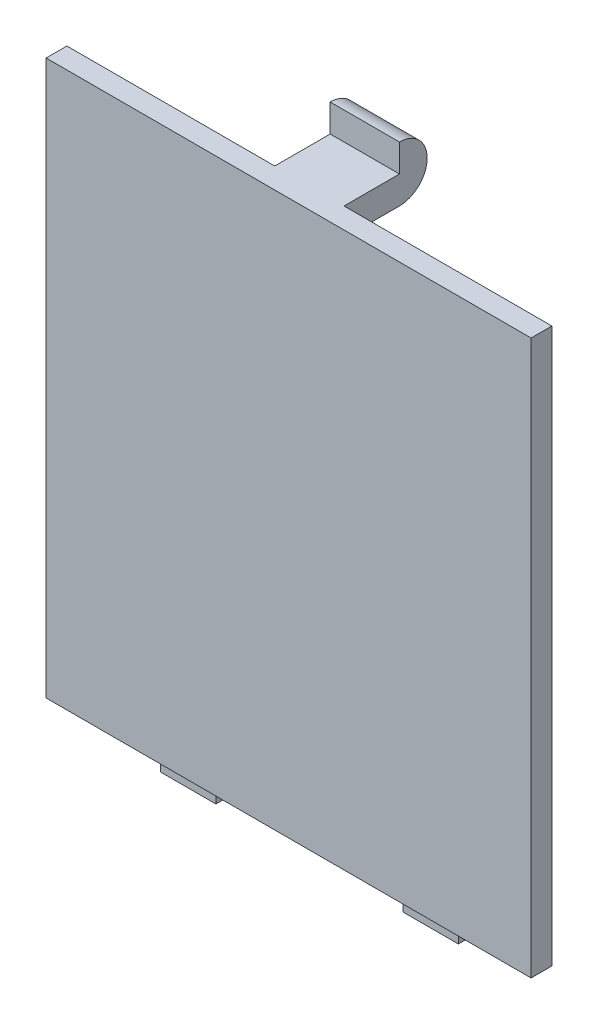
ISO-10303-21;
HEADER;
FILE_DESCRIPTION(('STEP AP214'),'2;1');
FILE_NAME('part.step','',(''),(''),'','','');
FILE_SCHEMA(('AUTOMOTIVE_DESIGN { 1 0 10303 214 1 1 1 1 }'));
ENDSEC;
DATA;
#1=APPLICATION_CONTEXT('core data for automotive mechanical design processes');
#2=APPLICATION_PROTOCOL_DEFINITION('international standard','automotive_design',2000,#1);
#3=PRODUCT_CONTEXT('',#1,'mechanical');
#4=PRODUCT('Part','Part','',(#3));
#5=PRODUCT_RELATED_PRODUCT_CATEGORY('part','',(#4));
#6=PRODUCT_DEFINITION_FORMATION('','',#4);
#7=PRODUCT_DEFINITION_CONTEXT('part definition',#1,'design');
#8=PRODUCT_DEFINITION('design','',#6,#7);
#9=PRODUCT_DEFINITION_SHAPE('','',#8);
#10=(LENGTH_UNIT() NAMED_UNIT(*) SI_UNIT(.MILLI.,.METRE.));
#11=(NAMED_UNIT(*) PLANE_ANGLE_UNIT() SI_UNIT($,.RADIAN.));
#12=(NAMED_UNIT(*) SI_UNIT($,.STERADIAN.) SOLID_ANGLE_UNIT());
#13=UNCERTAINTY_MEASURE_WITH_UNIT(LENGTH_MEASURE(1.E-05),#10,'distance_accuracy_value','');
#14=(GEOMETRIC_REPRESENTATION_CONTEXT(3) GLOBAL_UNCERTAINTY_ASSIGNED_CONTEXT((#13)) GLOBAL_UNIT_ASSIGNED_CONTEXT((#10,
#11,#12)) REPRESENTATION_CONTEXT('',''));
#15=CARTESIAN_POINT('',(0.,0.,0.));
#16=DIRECTION('',(0.,0.,1.));
#17=DIRECTION('',(1.,0.,0.));
#18=AXIS2_PLACEMENT_3D('',#15,#16,#17);
#19=CARTESIAN_POINT('',(5.,45.,-8.));
#20=DIRECTION('',(1.,0.,0.));
#21=DIRECTION('',(0.,0.,-1.));
#22=AXIS2_PLACEMENT_3D('',#19,#20,#21);
#23=CYLINDRICAL_SURFACE('',#22,4.);
#24=DIRECTION('',(1.,0.,0.));
#25=VECTOR('',#24,1.);
#26=CARTESIAN_POINT('',(5.,41.,-8.));
#27=LINE('',#26,#25);
#28=CARTESIAN_POINT('',(-5.,41.,-8.));
#29=VERTEX_POINT('',#28);
#30=CARTESIAN_POINT('',(5.,41.,-8.));
#31=VERTEX_POINT('',#30);
#32=EDGE_CURVE('E316',#29,#31,#27,.T.);
#33=ORIENTED_EDGE('',*,*,#32,.F.);
#34=CARTESIAN_POINT('',(-5.,45.,-8.));
#35=DIRECTION('',(-1.,0.,0.));
#36=DIRECTION('',(0.,-1.,0.));
#37=AXIS2_PLACEMENT_3D('',#34,#35,#36);
#38=CIRCLE('',#37,4.);
#39=CARTESIAN_POINT('',(-5.,45.,-12.));
#40=VERTEX_POINT('',#39);
#41=EDGE_CURVE('E29',#40,#29,#38,.T.);
#42=ORIENTED_EDGE('',*,*,#41,.F.);
#43=DIRECTION('',(-1.,0.,0.));
#44=VECTOR('',#43,1.);
#45=CARTESIAN_POINT('',(5.,45.,-12.));
#46=LINE('',#45,#44);
#47=CARTESIAN_POINT('',(5.,45.,-12.));
#48=VERTEX_POINT('',#47);
#49=EDGE_CURVE('E326',#40,#48,#46,.F.);
#50=ORIENTED_EDGE('',*,*,#49,.T.);
#51=CARTESIAN_POINT('',(5.,45.,-8.));
#52=DIRECTION('',(1.,0.,0.));
#53=DIRECTION('',(0.,1.,0.));
#54=AXIS2_PLACEMENT_3D('',#51,#52,#53);
#55=CIRCLE('',#54,4.);
#56=EDGE_CURVE('E12',#31,#48,#55,.T.);
#57=ORIENTED_EDGE('',*,*,#56,.F.);
#58=EDGE_LOOP('',(#33,#42,#50,#57));
#59=FACE_BOUND('',#58,.T.);
#60=ADVANCED_FACE('F20',(#59),#23,.T.);
#61=CARTESIAN_POINT('',(5.,45.,-8.));
#62=DIRECTION('',(1.,0.,0.));
#63=DIRECTION('',(0.,0.,-1.));
#64=AXIS2_PLACEMENT_3D('',#61,#62,#63);
#65=CYLINDRICAL_SURFACE('',#64,4.);
#66=DIRECTION('',(-1.,0.,0.));
#67=VECTOR('',#66,1.);
#68=CARTESIAN_POINT('',(5.,49.,-8.));
#69=LINE('',#68,#67);
#70=CARTESIAN_POINT('',(5.,49.,-8.));
#71=VERTEX_POINT('',#70);
#72=CARTESIAN_POINT('',(-5.,49.,-8.));
#73=VERTEX_POINT('',#72);
#74=EDGE_CURVE('E168',#71,#73,#69,.T.);
#75=ORIENTED_EDGE('',*,*,#74,.F.);
#76=CARTESIAN_POINT('',(5.,45.,-8.));
#77=DIRECTION('',(1.,0.,0.));
#78=DIRECTION('',(0.,1.,0.));
#79=AXIS2_PLACEMENT_3D('',#76,#77,#78);
#80=CIRCLE('',#79,4.);
#81=EDGE_CURVE('E163',#48,#71,#80,.T.);
#82=ORIENTED_EDGE('',*,*,#81,.F.);
#83=ORIENTED_EDGE('',*,*,#49,.F.);
#84=CARTESIAN_POINT('',(-5.,45.,-8.));
#85=DIRECTION('',(-1.,0.,0.));
#86=DIRECTION('',(0.,-1.,0.));
#87=AXIS2_PLACEMENT_3D('',#84,#85,#86);
#88=CIRCLE('',#87,4.);
#89=EDGE_CURVE('E320',#73,#40,#88,.T.);
#90=ORIENTED_EDGE('',*,*,#89,.F.);
#91=EDGE_LOOP('',(#75,#82,#83,#90));
#92=FACE_BOUND('',#91,.T.);
#93=ADVANCED_FACE('F381',(#92),#65,.T.);
#94=CARTESIAN_POINT('',(-13.5,-34.,0.));
#95=DIRECTION('',(-1.,0.,0.));
#96=DIRECTION('',(0.,0.,1.));
#97=AXIS2_PLACEMENT_3D('',#94,#95,#96);
#98=CYLINDRICAL_SURFACE('',#97,3.);
#99=DIRECTION('',(-1.,0.,0.));
#100=VECTOR('',#99,1.);
#101=CARTESIAN_POINT('',(-13.5,-31.,0.));
#102=LINE('',#101,#100);
#103=CARTESIAN_POINT('',(-13.5,-31.,0.));
#104=VERTEX_POINT('',#103);
#105=CARTESIAN_POINT('',(-21.5,-31.,0.));
#106=VERTEX_POINT('',#105);
#107=EDGE_CURVE('E263',#104,#106,#102,.T.);
#108=ORIENTED_EDGE('',*,*,#107,.F.);
#109=CARTESIAN_POINT('',(-13.5,-34.,0.));
#110=DIRECTION('',(1.,0.,0.));
#111=DIRECTION('',(0.,1.,0.));
#112=AXIS2_PLACEMENT_3D('',#109,#110,#111);
#113=CIRCLE('',#112,3.);
#114=CARTESIAN_POINT('',(-13.5,-34.,-3.));
#115=VERTEX_POINT('',#114);
#116=EDGE_CURVE('E332',#115,#104,#113,.T.);
#117=ORIENTED_EDGE('',*,*,#116,.F.);
#118=DIRECTION('',(-1.,0.,0.));
#119=VECTOR('',#118,1.);
#120=CARTESIAN_POINT('',(0.,-34.,-3.));
#121=LINE('',#120,#119);
#122=CARTESIAN_POINT('',(-21.5,-34.,-3.));
#123=VERTEX_POINT('',#122);
#124=EDGE_CURVE('E335',#123,#115,#121,.F.);
#125=ORIENTED_EDGE('',*,*,#124,.F.);
#126=CARTESIAN_POINT('',(-21.5,-34.,0.));
#127=DIRECTION('',(-1.,0.,0.));
#128=DIRECTION('',(0.,0.,1.));
#129=AXIS2_PLACEMENT_3D('',#126,#127,#128);
#130=CIRCLE('',#129,3.);
#131=EDGE_CURVE('E329',#106,#123,#130,.T.);
#132=ORIENTED_EDGE('',*,*,#131,.F.);
#133=EDGE_LOOP('',(#108,#117,#125,#132));
#134=FACE_BOUND('',#133,.T.);
#135=ADVANCED_FACE('F389',(#134),#98,.T.);
#136=CARTESIAN_POINT('',(21.5,-34.,0.));
#137=DIRECTION('',(-1.,0.,0.));
#138=DIRECTION('',(0.,0.,1.));
#139=AXIS2_PLACEMENT_3D('',#136,#137,#138);
#140=CYLINDRICAL_SURFACE('',#139,3.);
#141=DIRECTION('',(-1.,0.,0.));
#142=VECTOR('',#141,1.);
#143=CARTESIAN_POINT('',(21.5,-31.,0.));
#144=LINE('',#143,#142);
#145=CARTESIAN_POINT('',(21.5,-31.,0.));
#146=VERTEX_POINT('',#145);
#147=CARTESIAN_POINT('',(13.5,-31.,0.));
#148=VERTEX_POINT('',#147);
#149=EDGE_CURVE('E693',#146,#148,#144,.T.);
#150=ORIENTED_EDGE('',*,*,#149,.F.);
#151=CARTESIAN_POINT('',(21.5,-34.,0.));
#152=DIRECTION('',(1.,0.,0.));
#153=DIRECTION('',(0.,0.,-1.));
#154=AXIS2_PLACEMENT_3D('',#151,#152,#153);
#155=CIRCLE('',#154,3.);
#156=CARTESIAN_POINT('',(21.5,-34.,-3.));
#157=VERTEX_POINT('',#156);
#158=EDGE_CURVE('E342',#157,#146,#155,.T.);
#159=ORIENTED_EDGE('',*,*,#158,.F.);
#160=DIRECTION('',(-1.,0.,0.));
#161=VECTOR('',#160,1.);
#162=CARTESIAN_POINT('',(0.,-34.,-3.));
#163=LINE('',#162,#161);
#164=CARTESIAN_POINT('',(13.5,-34.,-3.));
#165=VERTEX_POINT('',#164);
#166=EDGE_CURVE('E345',#165,#157,#163,.F.);
#167=ORIENTED_EDGE('',*,*,#166,.F.);
#168=CARTESIAN_POINT('',(13.5,-34.,0.));
#169=DIRECTION('',(-1.,0.,0.));
#170=DIRECTION('',(0.,-1.,0.));
#171=AXIS2_PLACEMENT_3D('',#168,#169,#170);
#172=CIRCLE('',#171,3.);
#173=EDGE_CURVE('E339',#148,#165,#172,.T.);
#174=ORIENTED_EDGE('',*,*,#173,.F.);
#175=EDGE_LOOP('',(#150,#159,#167,#174));
#176=FACE_BOUND('',#175,.T.);
#177=ADVANCED_FACE('F393',(#176),#140,.T.);
#178=CARTESIAN_POINT('',(-35.,45.,3.));
#179=DIRECTION('',(1.,0.,0.));
#180=DIRECTION('',(0.,1.,0.));
#181=AXIS2_PLACEMENT_3D('',#178,#179,#180);
#182=PLANE('',#181);
#183=DIRECTION('',(0.,-1.,0.));
#184=VECTOR('',#183,1.);
#185=CARTESIAN_POINT('',(-35.,45.,0.));
#186=LINE('',#185,#184);
#187=CARTESIAN_POINT('',(-35.,45.,0.));
#188=VERTEX_POINT('',#187);
#189=CARTESIAN_POINT('',(-35.,-35.,0.));
#190=VERTEX_POINT('',#189);
#191=EDGE_CURVE('E228',#188,#190,#186,.T.);
#192=ORIENTED_EDGE('',*,*,#191,.T.);
#193=DIRECTION('',(0.,0.,-1.));
#194=VECTOR('',#193,1.);
#195=CARTESIAN_POINT('',(-35.,-35.,3.));
#196=LINE('',#195,#194);
#197=CARTESIAN_POINT('',(-35.,-35.,3.));
#198=VERTEX_POINT('',#197);
#199=EDGE_CURVE('E354',#198,#190,#196,.T.);
#200=ORIENTED_EDGE('',*,*,#199,.F.);
#201=DIRECTION('',(0.,-1.,0.));
#202=VECTOR('',#201,1.);
#203=CARTESIAN_POINT('',(-35.,45.,3.));
#204=LINE('',#203,#202);
#205=CARTESIAN_POINT('',(-35.,45.,3.));
#206=VERTEX_POINT('',#205);
#207=EDGE_CURVE('E210',#206,#198,#204,.T.);
#208=ORIENTED_EDGE('',*,*,#207,.F.);
#209=DIRECTION('',(0.,0.,-1.));
#210=VECTOR('',#209,1.);
#211=CARTESIAN_POINT('',(-35.,45.,3.));
#212=LINE('',#211,#210);
#213=EDGE_CURVE('E227',#206,#188,#212,.T.);
#214=ORIENTED_EDGE('',*,*,#213,.T.);
#215=EDGE_LOOP('',(#192,#200,#208,#214));
#216=FACE_BOUND('',#215,.T.);
#217=ADVANCED_FACE('F399',(#216),#182,.F.);
#218=CARTESIAN_POINT('',(-35.,-35.,3.));
#219=DIRECTION('',(0.,1.,0.));
#220=DIRECTION('',(0.,0.,1.));
#221=AXIS2_PLACEMENT_3D('',#218,#219,#220);
#222=PLANE('',#221);
#223=DIRECTION('',(1.,0.,0.));
#224=VECTOR('',#223,1.);
#225=CARTESIAN_POINT('',(-35.,-35.,0.));
#226=LINE('',#225,#224);
#227=CARTESIAN_POINT('',(-21.5,-35.,0.));
#228=VERTEX_POINT('',#227);
#229=EDGE_CURVE('E235',#190,#228,#226,.T.);
#230=ORIENTED_EDGE('',*,*,#229,.T.);
#231=CARTESIAN_POINT('',(-13.5,-35.,0.));
#232=VERTEX_POINT('',#231);
#233=EDGE_CURVE('E241',#228,#232,#226,.T.);
#234=ORIENTED_EDGE('',*,*,#233,.T.);
#235=CARTESIAN_POINT('',(13.5,-35.,0.));
#236=VERTEX_POINT('',#235);
#237=EDGE_CURVE('E242',#232,#236,#226,.T.);
#238=ORIENTED_EDGE('',*,*,#237,.T.);
#239=CARTESIAN_POINT('',(21.5,-35.,0.));
#240=VERTEX_POINT('',#239);
#241=EDGE_CURVE('E243',#236,#240,#226,.T.);
#242=ORIENTED_EDGE('',*,*,#241,.T.);
#243=CARTESIAN_POINT('',(35.,-35.,0.));
#244=VERTEX_POINT('',#243);
#245=EDGE_CURVE('E233',#240,#244,#226,.T.);
#246=ORIENTED_EDGE('',*,*,#245,.T.);
#247=DIRECTION('',(0.,0.,-1.));
#248=VECTOR('',#247,1.);
#249=CARTESIAN_POINT('',(35.,-35.,3.));
#250=LINE('',#249,#248);
#251=CARTESIAN_POINT('',(35.,-35.,3.));
#252=VERTEX_POINT('',#251);
#253=EDGE_CURVE('E358',#252,#244,#250,.T.);
#254=ORIENTED_EDGE('',*,*,#253,.F.);
#255=DIRECTION('',(1.,0.,0.));
#256=VECTOR('',#255,1.);
#257=CARTESIAN_POINT('',(-35.,-35.,3.));
#258=LINE('',#257,#256);
#259=EDGE_CURVE('E216',#198,#252,#258,.T.);
#260=ORIENTED_EDGE('',*,*,#259,.F.);
#261=ORIENTED_EDGE('',*,*,#199,.T.);
#262=EDGE_LOOP('',(#230,#234,#238,#242,#246,#254,#260,#261));
#263=FACE_BOUND('',#262,.T.);
#264=ADVANCED_FACE('F403',(#263),#222,.F.);
#265=CARTESIAN_POINT('',(35.,45.,3.));
#266=DIRECTION('',(-1.,0.,0.));
#267=DIRECTION('',(0.,0.,1.));
#268=AXIS2_PLACEMENT_3D('',#265,#266,#267);
#269=PLANE('',#268);
#270=DIRECTION('',(0.,1.,0.));
#271=VECTOR('',#270,1.);
#272=CARTESIAN_POINT('',(35.,45.,0.));
#273=LINE('',#272,#271);
#274=CARTESIAN_POINT('',(35.,45.,0.));
#275=VERTEX_POINT('',#274);
#276=EDGE_CURVE('E240',#244,#275,#273,.T.);
#277=ORIENTED_EDGE('',*,*,#276,.T.);
#278=DIRECTION('',(0.,0.,-1.));
#279=VECTOR('',#278,1.);
#280=CARTESIAN_POINT('',(35.,45.,3.));
#281=LINE('',#280,#279);
#282=CARTESIAN_POINT('',(35.,45.,3.));
#283=VERTEX_POINT('',#282);
#284=EDGE_CURVE('E362',#283,#275,#281,.T.);
#285=ORIENTED_EDGE('',*,*,#284,.F.);
#286=DIRECTION('',(0.,1.,0.));
#287=VECTOR('',#286,1.);
#288=CARTESIAN_POINT('',(35.,45.,3.));
#289=LINE('',#288,#287);
#290=EDGE_CURVE('E221',#252,#283,#289,.T.);
#291=ORIENTED_EDGE('',*,*,#290,.F.);
#292=ORIENTED_EDGE('',*,*,#253,.T.);
#293=EDGE_LOOP('',(#277,#285,#291,#292));
#294=FACE_BOUND('',#293,.T.);
#295=ADVANCED_FACE('F374',(#294),#269,.F.);
#296=CARTESIAN_POINT('',(-35.,45.,3.));
#297=DIRECTION('',(0.,-1.,0.));
#298=DIRECTION('',(0.,0.,-1.));
#299=AXIS2_PLACEMENT_3D('',#296,#297,#298);
#300=PLANE('',#299);
#301=DIRECTION('',(0.,0.,1.));
#302=VECTOR('',#301,1.);
#303=CARTESIAN_POINT('',(5.,45.,-12.));
#304=LINE('',#303,#302);
#305=CARTESIAN_POINT('',(5.,45.,-8.));
#306=VERTEX_POINT('',#305);
#307=CARTESIAN_POINT('',(5.,45.,0.));
#308=VERTEX_POINT('',#307);
#309=EDGE_CURVE('E160',#306,#308,#304,.T.);
#310=ORIENTED_EDGE('',*,*,#309,.F.);
#311=DIRECTION('',(-1.,0.,0.));
#312=VECTOR('',#311,1.);
#313=CARTESIAN_POINT('',(5.,45.,-8.));
#314=LINE('',#313,#312);
#315=CARTESIAN_POINT('',(-5.,45.,-8.));
#316=VERTEX_POINT('',#315);
#317=EDGE_CURVE('E172',#306,#316,#314,.T.);
#318=ORIENTED_EDGE('',*,*,#317,.T.);
#319=DIRECTION('',(0.,0.,1.));
#320=VECTOR('',#319,1.);
#321=CARTESIAN_POINT('',(-5.,45.,-12.));
#322=LINE('',#321,#320);
#323=CARTESIAN_POINT('',(-5.,45.,0.));
#324=VERTEX_POINT('',#323);
#325=EDGE_CURVE('E186',#316,#324,#322,.T.);
#326=ORIENTED_EDGE('',*,*,#325,.T.);
#327=DIRECTION('',(-1.,0.,0.));
#328=VECTOR('',#327,1.);
#329=CARTESIAN_POINT('',(-35.,45.,0.));
#330=LINE('',#329,#328);
#331=EDGE_CURVE('E300',#324,#188,#330,.T.);
#332=ORIENTED_EDGE('',*,*,#331,.T.);
#333=ORIENTED_EDGE('',*,*,#213,.F.);
#334=DIRECTION('',(-1.,0.,0.));
#335=VECTOR('',#334,1.);
#336=CARTESIAN_POINT('',(-35.,45.,3.));
#337=LINE('',#336,#335);
#338=EDGE_CURVE('E224',#283,#206,#337,.T.);
#339=ORIENTED_EDGE('',*,*,#338,.F.);
#340=ORIENTED_EDGE('',*,*,#284,.T.);
#341=EDGE_CURVE('E184',#275,#308,#330,.T.);
#342=ORIENTED_EDGE('',*,*,#341,.T.);
#343=EDGE_LOOP('',(#310,#318,#326,#332,#333,#339,#340,#342));
#344=FACE_BOUND('',#343,.T.);
#345=ADVANCED_FACE('F181',(#344),#300,.F.);
#346=CARTESIAN_POINT('',(0.,0.,3.));
#347=DIRECTION('',(0.,0.,1.));
#348=DIRECTION('',(1.,0.,0.));
#349=AXIS2_PLACEMENT_3D('',#346,#347,#348);
#350=PLANE('',#349);
#351=ORIENTED_EDGE('',*,*,#207,.T.);
#352=ORIENTED_EDGE('',*,*,#259,.T.);
#353=ORIENTED_EDGE('',*,*,#290,.T.);
#354=ORIENTED_EDGE('',*,*,#338,.T.);
#355=EDGE_LOOP('',(#351,#352,#353,#354));
#356=FACE_BOUND('',#355,.T.);
#357=ADVANCED_FACE('F412',(#356),#350,.T.);
#358=CARTESIAN_POINT('',(0.,0.,0.));
#359=DIRECTION('',(0.,0.,1.));
#360=DIRECTION('',(1.,0.,0.));
#361=AXIS2_PLACEMENT_3D('',#358,#359,#360);
#362=PLANE('',#361);
#363=DIRECTION('',(1.,0.,0.));
#364=VECTOR('',#363,1.);
#365=CARTESIAN_POINT('',(5.,41.,0.));
#366=LINE('',#365,#364);
#367=CARTESIAN_POINT('',(-5.,41.,0.));
#368=VERTEX_POINT('',#367);
#369=CARTESIAN_POINT('',(5.,41.,0.));
#370=VERTEX_POINT('',#369);
#371=EDGE_CURVE('E187',#368,#370,#366,.T.);
#372=ORIENTED_EDGE('',*,*,#371,.T.);
#373=DIRECTION('',(0.,1.,0.));
#374=VECTOR('',#373,1.);
#375=CARTESIAN_POINT('',(5.,45.,0.));
#376=LINE('',#375,#374);
#377=EDGE_CURVE('E178',#370,#308,#376,.T.);
#378=ORIENTED_EDGE('',*,*,#377,.T.);
#379=ORIENTED_EDGE('',*,*,#341,.F.);
#380=ORIENTED_EDGE('',*,*,#276,.F.);
#381=ORIENTED_EDGE('',*,*,#245,.F.);
#382=DIRECTION('',(0.,1.,0.));
#383=VECTOR('',#382,1.);
#384=CARTESIAN_POINT('',(21.5,-31.,0.));
#385=LINE('',#384,#383);
#386=EDGE_CURVE('E353',#240,#146,#385,.T.);
#387=ORIENTED_EDGE('',*,*,#386,.T.);
#388=ORIENTED_EDGE('',*,*,#149,.T.);
#389=DIRECTION('',(0.,-1.,0.));
#390=VECTOR('',#389,1.);
#391=CARTESIAN_POINT('',(13.5,-31.,0.));
#392=LINE('',#391,#390);
#393=EDGE_CURVE('E690',#148,#236,#392,.T.);
#394=ORIENTED_EDGE('',*,*,#393,.T.);
#395=ORIENTED_EDGE('',*,*,#237,.F.);
#396=DIRECTION('',(0.,1.,0.));
#397=VECTOR('',#396,1.);
#398=CARTESIAN_POINT('',(-13.5,0.,0.));
#399=LINE('',#398,#397);
#400=EDGE_CURVE('E349',#232,#104,#399,.T.);
#401=ORIENTED_EDGE('',*,*,#400,.T.);
#402=ORIENTED_EDGE('',*,*,#107,.T.);
#403=DIRECTION('',(0.,-1.,0.));
#404=VECTOR('',#403,1.);
#405=CARTESIAN_POINT('',(-21.5,-31.,0.));
#406=LINE('',#405,#404);
#407=EDGE_CURVE('E660',#106,#228,#406,.T.);
#408=ORIENTED_EDGE('',*,*,#407,.T.);
#409=ORIENTED_EDGE('',*,*,#229,.F.);
#410=ORIENTED_EDGE('',*,*,#191,.F.);
#411=ORIENTED_EDGE('',*,*,#331,.F.);
#412=DIRECTION('',(0.,-1.,0.));
#413=VECTOR('',#412,1.);
#414=CARTESIAN_POINT('',(-5.,45.,0.));
#415=LINE('',#414,#413);
#416=EDGE_CURVE('E195',#324,#368,#415,.T.);
#417=ORIENTED_EDGE('',*,*,#416,.T.);
#418=EDGE_LOOP('',(#372,#378,#379,#380,#381,#387,#388,#394,#395,#401,#402,#408,#409,#410,#411,#417));
#419=FACE_BOUND('',#418,.T.);
#420=ADVANCED_FACE('F298',(#419),#362,.F.);
#421=CARTESIAN_POINT('',(21.5,-31.,-3.));
#422=DIRECTION('',(1.,0.,0.));
#423=DIRECTION('',(0.,0.,-1.));
#424=AXIS2_PLACEMENT_3D('',#421,#422,#423);
#425=PLANE('',#424);
#426=DIRECTION('',(0.,1.,0.));
#427=VECTOR('',#426,1.);
#428=CARTESIAN_POINT('',(21.5,-31.,-3.));
#429=LINE('',#428,#427);
#430=CARTESIAN_POINT('',(21.5,-39.,-3.));
#431=VERTEX_POINT('',#430);
#432=EDGE_CURVE('E699',#431,#157,#429,.T.);
#433=ORIENTED_EDGE('',*,*,#432,.T.);
#434=ORIENTED_EDGE('',*,*,#158,.T.);
#435=ORIENTED_EDGE('',*,*,#386,.F.);
#436=CARTESIAN_POINT('',(21.5,-39.,0.));
#437=VERTEX_POINT('',#436);
#438=EDGE_CURVE('E262',#437,#240,#385,.T.);
#439=ORIENTED_EDGE('',*,*,#438,.F.);
#440=DIRECTION('',(0.,0.,1.));
#441=VECTOR('',#440,1.);
#442=CARTESIAN_POINT('',(21.5,-39.,-3.));
#443=LINE('',#442,#441);
#444=EDGE_CURVE('E234',#431,#437,#443,.T.);
#445=ORIENTED_EDGE('',*,*,#444,.F.);
#446=EDGE_LOOP('',(#433,#434,#435,#439,#445));
#447=FACE_BOUND('',#446,.T.);
#448=ADVANCED_FACE('F415',(#447),#425,.T.);
#449=CARTESIAN_POINT('',(21.5,-39.,-3.));
#450=DIRECTION('',(0.,-1.,0.));
#451=DIRECTION('',(0.,0.,-1.));
#452=AXIS2_PLACEMENT_3D('',#449,#450,#451);
#453=PLANE('',#452);
#454=DIRECTION('',(1.,0.,0.));
#455=VECTOR('',#454,1.);
#456=CARTESIAN_POINT('',(21.5,-39.,0.));
#457=LINE('',#456,#455);
#458=CARTESIAN_POINT('',(13.5,-39.,0.));
#459=VERTEX_POINT('',#458);
#460=EDGE_CURVE('E695',#459,#437,#457,.T.);
#461=ORIENTED_EDGE('',*,*,#460,.F.);
#462=DIRECTION('',(0.,0.,1.));
#463=VECTOR('',#462,1.);
#464=CARTESIAN_POINT('',(13.5,-39.,-3.));
#465=LINE('',#464,#463);
#466=CARTESIAN_POINT('',(13.5,-39.,-3.));
#467=VERTEX_POINT('',#466);
#468=EDGE_CURVE('E217',#467,#459,#465,.T.);
#469=ORIENTED_EDGE('',*,*,#468,.F.);
#470=DIRECTION('',(1.,0.,0.));
#471=VECTOR('',#470,1.);
#472=CARTESIAN_POINT('',(21.5,-39.,-3.));
#473=LINE('',#472,#471);
#474=EDGE_CURVE('E713',#467,#431,#473,.T.);
#475=ORIENTED_EDGE('',*,*,#474,.T.);
#476=ORIENTED_EDGE('',*,*,#444,.T.);
#477=EDGE_LOOP('',(#461,#469,#475,#476));
#478=FACE_BOUND('',#477,.T.);
#479=ADVANCED_FACE('F421',(#478),#453,.T.);
#480=CARTESIAN_POINT('',(13.5,-31.,-3.));
#481=DIRECTION('',(-1.,0.,0.));
#482=DIRECTION('',(0.,-1.,0.));
#483=AXIS2_PLACEMENT_3D('',#480,#481,#482);
#484=PLANE('',#483);
#485=ORIENTED_EDGE('',*,*,#393,.F.);
#486=ORIENTED_EDGE('',*,*,#173,.T.);
#487=DIRECTION('',(0.,-1.,0.));
#488=VECTOR('',#487,1.);
#489=CARTESIAN_POINT('',(13.5,-31.,-3.));
#490=LINE('',#489,#488);
#491=EDGE_CURVE('E709',#165,#467,#490,.T.);
#492=ORIENTED_EDGE('',*,*,#491,.T.);
#493=ORIENTED_EDGE('',*,*,#468,.T.);
#494=EDGE_CURVE('E685',#236,#459,#392,.T.);
#495=ORIENTED_EDGE('',*,*,#494,.F.);
#496=EDGE_LOOP('',(#485,#486,#492,#493,#495));
#497=FACE_BOUND('',#496,.T.);
#498=ADVANCED_FACE('F423',(#497),#484,.T.);
#499=CARTESIAN_POINT('',(0.,0.,-3.));
#500=DIRECTION('',(0.,0.,-1.));
#501=DIRECTION('',(-1.,0.,0.));
#502=AXIS2_PLACEMENT_3D('',#499,#500,#501);
#503=PLANE('',#502);
#504=ORIENTED_EDGE('',*,*,#491,.F.);
#505=ORIENTED_EDGE('',*,*,#166,.T.);
#506=ORIENTED_EDGE('',*,*,#432,.F.);
#507=ORIENTED_EDGE('',*,*,#474,.F.);
#508=EDGE_LOOP('',(#504,#505,#506,#507));
#509=FACE_BOUND('',#508,.T.);
#510=ADVANCED_FACE('F426',(#509),#503,.T.);
#511=CARTESIAN_POINT('',(0.,0.,0.));
#512=DIRECTION('',(0.,0.,-1.));
#513=DIRECTION('',(-1.,0.,0.));
#514=AXIS2_PLACEMENT_3D('',#511,#512,#513);
#515=PLANE('',#514);
#516=ORIENTED_EDGE('',*,*,#241,.F.);
#517=ORIENTED_EDGE('',*,*,#494,.T.);
#518=ORIENTED_EDGE('',*,*,#460,.T.);
#519=ORIENTED_EDGE('',*,*,#438,.T.);
#520=EDGE_LOOP('',(#516,#517,#518,#519));
#521=FACE_BOUND('',#520,.T.);
#522=ADVANCED_FACE('F431',(#521),#515,.F.);
#523=CARTESIAN_POINT('',(0.,0.,0.));
#524=DIRECTION('',(0.,0.,-1.));
#525=DIRECTION('',(-1.,0.,0.));
#526=AXIS2_PLACEMENT_3D('',#523,#524,#525);
#527=PLANE('',#526);
#528=DIRECTION('',(0.,1.,0.));
#529=VECTOR('',#528,1.);
#530=CARTESIAN_POINT('',(-13.5,-31.,0.));
#531=LINE('',#530,#529);
#532=CARTESIAN_POINT('',(-13.5,-39.,0.));
#533=VERTEX_POINT('',#532);
#534=EDGE_CURVE('E256',#533,#232,#531,.T.);
#535=ORIENTED_EDGE('',*,*,#534,.T.);
#536=ORIENTED_EDGE('',*,*,#233,.F.);
#537=CARTESIAN_POINT('',(-21.5,-39.,0.));
#538=VERTEX_POINT('',#537);
#539=EDGE_CURVE('E656',#228,#538,#406,.T.);
#540=ORIENTED_EDGE('',*,*,#539,.T.);
#541=DIRECTION('',(1.,0.,0.));
#542=VECTOR('',#541,1.);
#543=CARTESIAN_POINT('',(-13.5,-39.,0.));
#544=LINE('',#543,#542);
#545=EDGE_CURVE('E653',#538,#533,#544,.T.);
#546=ORIENTED_EDGE('',*,*,#545,.T.);
#547=EDGE_LOOP('',(#535,#536,#540,#546));
#548=FACE_BOUND('',#547,.T.);
#549=ADVANCED_FACE('F434',(#548),#527,.F.);
#550=CARTESIAN_POINT('',(-13.5,-31.,-3.));
#551=DIRECTION('',(1.,0.,0.));
#552=DIRECTION('',(0.,1.,0.));
#553=AXIS2_PLACEMENT_3D('',#550,#551,#552);
#554=PLANE('',#553);
#555=DIRECTION('',(0.,1.,0.));
#556=VECTOR('',#555,1.);
#557=CARTESIAN_POINT('',(-13.5,-31.,-3.));
#558=LINE('',#557,#556);
#559=CARTESIAN_POINT('',(-13.5,-39.,-3.));
#560=VERTEX_POINT('',#559);
#561=EDGE_CURVE('E272',#560,#115,#558,.T.);
#562=ORIENTED_EDGE('',*,*,#561,.T.);
#563=ORIENTED_EDGE('',*,*,#116,.T.);
#564=ORIENTED_EDGE('',*,*,#400,.F.);
#565=ORIENTED_EDGE('',*,*,#534,.F.);
#566=DIRECTION('',(0.,0.,1.));
#567=VECTOR('',#566,1.);
#568=CARTESIAN_POINT('',(-13.5,-39.,-3.));
#569=LINE('',#568,#567);
#570=EDGE_CURVE('E284',#560,#533,#569,.T.);
#571=ORIENTED_EDGE('',*,*,#570,.F.);
#572=EDGE_LOOP('',(#562,#563,#564,#565,#571));
#573=FACE_BOUND('',#572,.T.);
#574=ADVANCED_FACE('F446',(#573),#554,.T.);
#575=CARTESIAN_POINT('',(-13.5,-39.,-3.));
#576=DIRECTION('',(0.,-1.,0.));
#577=DIRECTION('',(0.,0.,-1.));
#578=AXIS2_PLACEMENT_3D('',#575,#576,#577);
#579=PLANE('',#578);
#580=ORIENTED_EDGE('',*,*,#545,.F.);
#581=DIRECTION('',(0.,0.,1.));
#582=VECTOR('',#581,1.);
#583=CARTESIAN_POINT('',(-21.5,-39.,-3.));
#584=LINE('',#583,#582);
#585=CARTESIAN_POINT('',(-21.5,-39.,-3.));
#586=VERTEX_POINT('',#585);
#587=EDGE_CURVE('E200',#586,#538,#584,.T.);
#588=ORIENTED_EDGE('',*,*,#587,.F.);
#589=DIRECTION('',(1.,0.,0.));
#590=VECTOR('',#589,1.);
#591=CARTESIAN_POINT('',(-13.5,-39.,-3.));
#592=LINE('',#591,#590);
#593=EDGE_CURVE('E265',#586,#560,#592,.T.);
#594=ORIENTED_EDGE('',*,*,#593,.T.);
#595=ORIENTED_EDGE('',*,*,#570,.T.);
#596=EDGE_LOOP('',(#580,#588,#594,#595));
#597=FACE_BOUND('',#596,.T.);
#598=ADVANCED_FACE('F448',(#597),#579,.T.);
#599=CARTESIAN_POINT('',(-21.5,-31.,-3.));
#600=DIRECTION('',(-1.,0.,0.));
#601=DIRECTION('',(0.,0.,1.));
#602=AXIS2_PLACEMENT_3D('',#599,#600,#601);
#603=PLANE('',#602);
#604=ORIENTED_EDGE('',*,*,#407,.F.);
#605=ORIENTED_EDGE('',*,*,#131,.T.);
#606=DIRECTION('',(0.,-1.,0.));
#607=VECTOR('',#606,1.);
#608=CARTESIAN_POINT('',(-21.5,-31.,-3.));
#609=LINE('',#608,#607);
#610=EDGE_CURVE('E269',#123,#586,#609,.T.);
#611=ORIENTED_EDGE('',*,*,#610,.T.);
#612=ORIENTED_EDGE('',*,*,#587,.T.);
#613=ORIENTED_EDGE('',*,*,#539,.F.);
#614=EDGE_LOOP('',(#604,#605,#611,#612,#613));
#615=FACE_BOUND('',#614,.T.);
#616=ADVANCED_FACE('F442',(#615),#603,.T.);
#617=CARTESIAN_POINT('',(0.,0.,-3.));
#618=DIRECTION('',(0.,0.,-1.));
#619=DIRECTION('',(-1.,0.,0.));
#620=AXIS2_PLACEMENT_3D('',#617,#618,#619);
#621=PLANE('',#620);
#622=ORIENTED_EDGE('',*,*,#610,.F.);
#623=ORIENTED_EDGE('',*,*,#124,.T.);
#624=ORIENTED_EDGE('',*,*,#561,.F.);
#625=ORIENTED_EDGE('',*,*,#593,.F.);
#626=EDGE_LOOP('',(#622,#623,#624,#625));
#627=FACE_BOUND('',#626,.T.);
#628=ADVANCED_FACE('F439',(#627),#621,.T.);
#629=CARTESIAN_POINT('',(5.,45.,-12.));
#630=DIRECTION('',(1.,0.,0.));
#631=DIRECTION('',(0.,1.,0.));
#632=AXIS2_PLACEMENT_3D('',#629,#630,#631);
#633=PLANE('',#632);
#634=DIRECTION('',(0.,0.,1.));
#635=VECTOR('',#634,1.);
#636=CARTESIAN_POINT('',(5.,41.,-12.));
#637=LINE('',#636,#635);
#638=EDGE_CURVE('E281',#31,#370,#637,.T.);
#639=ORIENTED_EDGE('',*,*,#638,.F.);
#640=ORIENTED_EDGE('',*,*,#56,.T.);
#641=ORIENTED_EDGE('',*,*,#81,.T.);
#642=DIRECTION('',(0.,-1.,0.));
#643=VECTOR('',#642,1.);
#644=CARTESIAN_POINT('',(5.,49.,-8.));
#645=LINE('',#644,#643);
#646=EDGE_CURVE('E154',#71,#306,#645,.T.);
#647=ORIENTED_EDGE('',*,*,#646,.T.);
#648=ORIENTED_EDGE('',*,*,#309,.T.);
#649=ORIENTED_EDGE('',*,*,#377,.F.);
#650=EDGE_LOOP('',(#639,#640,#641,#647,#648,#649));
#651=FACE_BOUND('',#650,.T.);
#652=ADVANCED_FACE('F157',(#651),#633,.T.);
#653=CARTESIAN_POINT('',(5.,41.,-12.));
#654=DIRECTION('',(0.,-1.,0.));
#655=DIRECTION('',(0.,0.,-1.));
#656=AXIS2_PLACEMENT_3D('',#653,#654,#655);
#657=PLANE('',#656);
#658=DIRECTION('',(0.,0.,1.));
#659=VECTOR('',#658,1.);
#660=CARTESIAN_POINT('',(-5.,41.,-12.));
#661=LINE('',#660,#659);
#662=EDGE_CURVE('E192',#29,#368,#661,.T.);
#663=ORIENTED_EDGE('',*,*,#662,.F.);
#664=ORIENTED_EDGE('',*,*,#32,.T.);
#665=ORIENTED_EDGE('',*,*,#638,.T.);
#666=ORIENTED_EDGE('',*,*,#371,.F.);
#667=EDGE_LOOP('',(#663,#664,#665,#666));
#668=FACE_BOUND('',#667,.T.);
#669=ADVANCED_FACE('F296',(#668),#657,.T.);
#670=CARTESIAN_POINT('',(-5.,45.,-12.));
#671=DIRECTION('',(-1.,0.,0.));
#672=DIRECTION('',(0.,-1.,0.));
#673=AXIS2_PLACEMENT_3D('',#670,#671,#672);
#674=PLANE('',#673);
#675=ORIENTED_EDGE('',*,*,#89,.T.);
#676=ORIENTED_EDGE('',*,*,#41,.T.);
#677=ORIENTED_EDGE('',*,*,#662,.T.);
#678=ORIENTED_EDGE('',*,*,#416,.F.);
#679=ORIENTED_EDGE('',*,*,#325,.F.);
#680=DIRECTION('',(0.,-1.,0.));
#681=VECTOR('',#680,1.);
#682=CARTESIAN_POINT('',(-5.,49.,-8.));
#683=LINE('',#682,#681);
#684=EDGE_CURVE('E169',#73,#316,#683,.T.);
#685=ORIENTED_EDGE('',*,*,#684,.F.);
#686=EDGE_LOOP('',(#675,#676,#677,#678,#679,#685));
#687=FACE_BOUND('',#686,.T.);
#688=ADVANCED_FACE('F292',(#687),#674,.T.);
#689=CARTESIAN_POINT('',(5.,49.,-8.));
#690=DIRECTION('',(0.,0.,-1.));
#691=DIRECTION('',(-1.,0.,0.));
#692=AXIS2_PLACEMENT_3D('',#689,#690,#691);
#693=PLANE('',#692);
#694=ORIENTED_EDGE('',*,*,#684,.T.);
#695=ORIENTED_EDGE('',*,*,#317,.F.);
#696=ORIENTED_EDGE('',*,*,#646,.F.);
#697=ORIENTED_EDGE('',*,*,#74,.T.);
#698=EDGE_LOOP('',(#694,#695,#696,#697));
#699=FACE_BOUND('',#698,.T.);
#700=ADVANCED_FACE('F173',(#699),#693,.F.);
#701=CLOSED_SHELL('',(#60,#93,#135,#177,#217,#264,#295,#345,#357,#420,#448,#479,#498,#510,#522,
#549,#574,#598,#616,#628,#652,#669,#688,#700));
#702=MANIFOLD_SOLID_BREP('B1',#701);
#703=ADVANCED_BREP_SHAPE_REPRESENTATION('',(#18,#702),#14);
#704=SHAPE_DEFINITION_REPRESENTATION(#9,#703);
ENDSEC;
END-ISO-10303-21;
